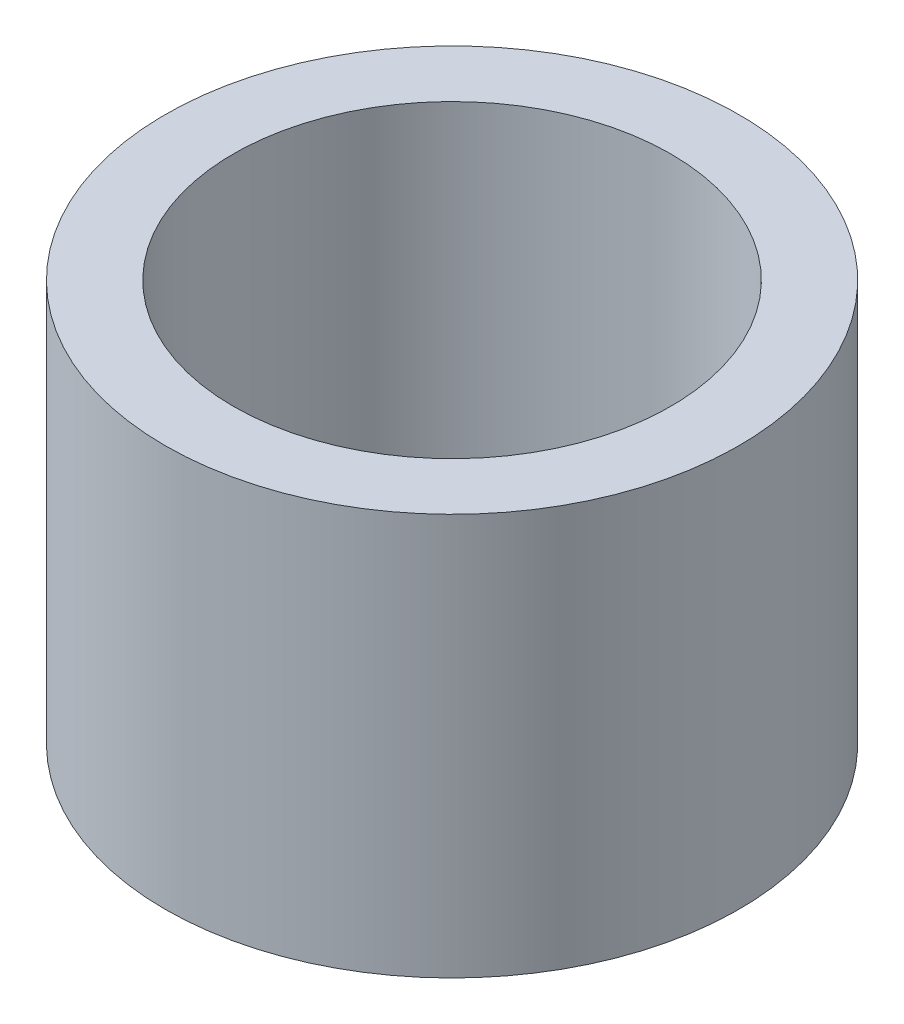
ISO-10303-21;
HEADER;
FILE_DESCRIPTION(('STEP AP214'),'2;1');
FILE_NAME('part.step','',(''),(''),'','','');
FILE_SCHEMA(('AUTOMOTIVE_DESIGN { 1 0 10303 214 1 1 1 1 }'));
ENDSEC;
DATA;
#1=APPLICATION_CONTEXT('core data for automotive mechanical design processes');
#2=APPLICATION_PROTOCOL_DEFINITION('international standard','automotive_design',2000,#1);
#3=PRODUCT_CONTEXT('',#1,'mechanical');
#4=PRODUCT('Part','Part','',(#3));
#5=PRODUCT_RELATED_PRODUCT_CATEGORY('part','',(#4));
#6=PRODUCT_DEFINITION_FORMATION('','',#4);
#7=PRODUCT_DEFINITION_CONTEXT('part definition',#1,'design');
#8=PRODUCT_DEFINITION('design','',#6,#7);
#9=PRODUCT_DEFINITION_SHAPE('','',#8);
#10=(LENGTH_UNIT() NAMED_UNIT(*) SI_UNIT(.MILLI.,.METRE.));
#11=(NAMED_UNIT(*) PLANE_ANGLE_UNIT() SI_UNIT($,.RADIAN.));
#12=(NAMED_UNIT(*) SI_UNIT($,.STERADIAN.) SOLID_ANGLE_UNIT());
#13=UNCERTAINTY_MEASURE_WITH_UNIT(LENGTH_MEASURE(1.E-05),#10,'distance_accuracy_value','');
#14=(GEOMETRIC_REPRESENTATION_CONTEXT(3) GLOBAL_UNCERTAINTY_ASSIGNED_CONTEXT((#13)) GLOBAL_UNIT_ASSIGNED_CONTEXT((#10,
#11,#12)) REPRESENTATION_CONTEXT('',''));
#15=CARTESIAN_POINT('',(0.,0.,0.));
#16=DIRECTION('',(0.,0.,1.));
#17=DIRECTION('',(1.,0.,0.));
#18=AXIS2_PLACEMENT_3D('',#15,#16,#17);
#19=CARTESIAN_POINT('',(0.,5.6,0.));
#20=DIRECTION('',(0.,1.,0.));
#21=DIRECTION('',(0.,0.,1.));
#22=AXIS2_PLACEMENT_3D('',#19,#20,#21);
#23=PLANE('',#22);
#24=CARTESIAN_POINT('',(0.,5.6,0.));
#25=DIRECTION('',(0.,1.,0.));
#26=DIRECTION('',(0.,0.,1.));
#27=AXIS2_PLACEMENT_3D('',#24,#25,#26);
#28=CIRCLE('',#27,4.);
#29=CARTESIAN_POINT('',(0.,5.6,4.));
#30=VERTEX_POINT('',#29);
#31=EDGE_CURVE('E10',#30,#30,#28,.T.);
#32=ORIENTED_EDGE('',*,*,#31,.T.);
#33=EDGE_LOOP('',(#32));
#34=FACE_BOUND('',#33,.T.);
#35=CARTESIAN_POINT('',(0.,5.6,0.));
#36=DIRECTION('',(0.,1.,0.));
#37=DIRECTION('',(0.,0.,1.));
#38=AXIS2_PLACEMENT_3D('',#35,#36,#37);
#39=CIRCLE('',#38,3.05);
#40=CARTESIAN_POINT('',(0.,5.6,3.05));
#41=VERTEX_POINT('',#40);
#42=EDGE_CURVE('E42',#41,#41,#39,.T.);
#43=ORIENTED_EDGE('',*,*,#42,.F.);
#44=EDGE_LOOP('',(#43));
#45=FACE_BOUND('',#44,.T.);
#46=ADVANCED_FACE('F31',(#34,#45),#23,.T.);
#47=CARTESIAN_POINT('',(0.,0.,0.));
#48=DIRECTION('',(0.,1.,0.));
#49=DIRECTION('',(0.,0.,1.));
#50=AXIS2_PLACEMENT_3D('',#47,#48,#49);
#51=PLANE('',#50);
#52=CARTESIAN_POINT('',(0.,0.,0.));
#53=DIRECTION('',(0.,1.,0.));
#54=DIRECTION('',(0.,0.,1.));
#55=AXIS2_PLACEMENT_3D('',#52,#53,#54);
#56=CIRCLE('',#55,4.);
#57=CARTESIAN_POINT('',(0.,0.,4.));
#58=VERTEX_POINT('',#57);
#59=EDGE_CURVE('E35',#58,#58,#56,.T.);
#60=ORIENTED_EDGE('',*,*,#59,.F.);
#61=EDGE_LOOP('',(#60));
#62=FACE_BOUND('',#61,.T.);
#63=CARTESIAN_POINT('',(0.,0.,0.));
#64=DIRECTION('',(0.,1.,0.));
#65=DIRECTION('',(0.,0.,1.));
#66=AXIS2_PLACEMENT_3D('',#63,#64,#65);
#67=CIRCLE('',#66,3.05);
#68=CARTESIAN_POINT('',(0.,0.,3.05));
#69=VERTEX_POINT('',#68);
#70=EDGE_CURVE('E44',#69,#69,#67,.T.);
#71=ORIENTED_EDGE('',*,*,#70,.T.);
#72=EDGE_LOOP('',(#71));
#73=FACE_BOUND('',#72,.T.);
#74=ADVANCED_FACE('F54',(#62,#73),#51,.F.);
#75=CARTESIAN_POINT('',(0.,5.6,0.));
#76=DIRECTION('',(0.,-1.,0.));
#77=DIRECTION('',(0.,0.,-1.));
#78=AXIS2_PLACEMENT_3D('',#75,#76,#77);
#79=CYLINDRICAL_SURFACE('',#78,4.);
#80=ORIENTED_EDGE('',*,*,#31,.F.);
#81=EDGE_LOOP('',(#80));
#82=FACE_BOUND('',#81,.T.);
#83=ORIENTED_EDGE('',*,*,#59,.T.);
#84=EDGE_LOOP('',(#83));
#85=FACE_BOUND('',#84,.T.);
#86=ADVANCED_FACE('F33',(#82,#85),#79,.T.);
#87=CARTESIAN_POINT('',(0.,5.6,0.));
#88=DIRECTION('',(0.,-1.,0.));
#89=DIRECTION('',(0.,0.,-1.));
#90=AXIS2_PLACEMENT_3D('',#87,#88,#89);
#91=CYLINDRICAL_SURFACE('',#90,3.05);
#92=ORIENTED_EDGE('',*,*,#42,.T.);
#93=EDGE_LOOP('',(#92));
#94=FACE_BOUND('',#93,.T.);
#95=ORIENTED_EDGE('',*,*,#70,.F.);
#96=EDGE_LOOP('',(#95));
#97=FACE_BOUND('',#96,.T.);
#98=ADVANCED_FACE('F50',(#94,#97),#91,.F.);
#99=CLOSED_SHELL('',(#46,#74,#86,#98));
#100=MANIFOLD_SOLID_BREP('B2',#99);
#101=ADVANCED_BREP_SHAPE_REPRESENTATION('',(#18,#100),#14);
#102=SHAPE_DEFINITION_REPRESENTATION(#9,#101);
ENDSEC;
END-ISO-10303-21;
